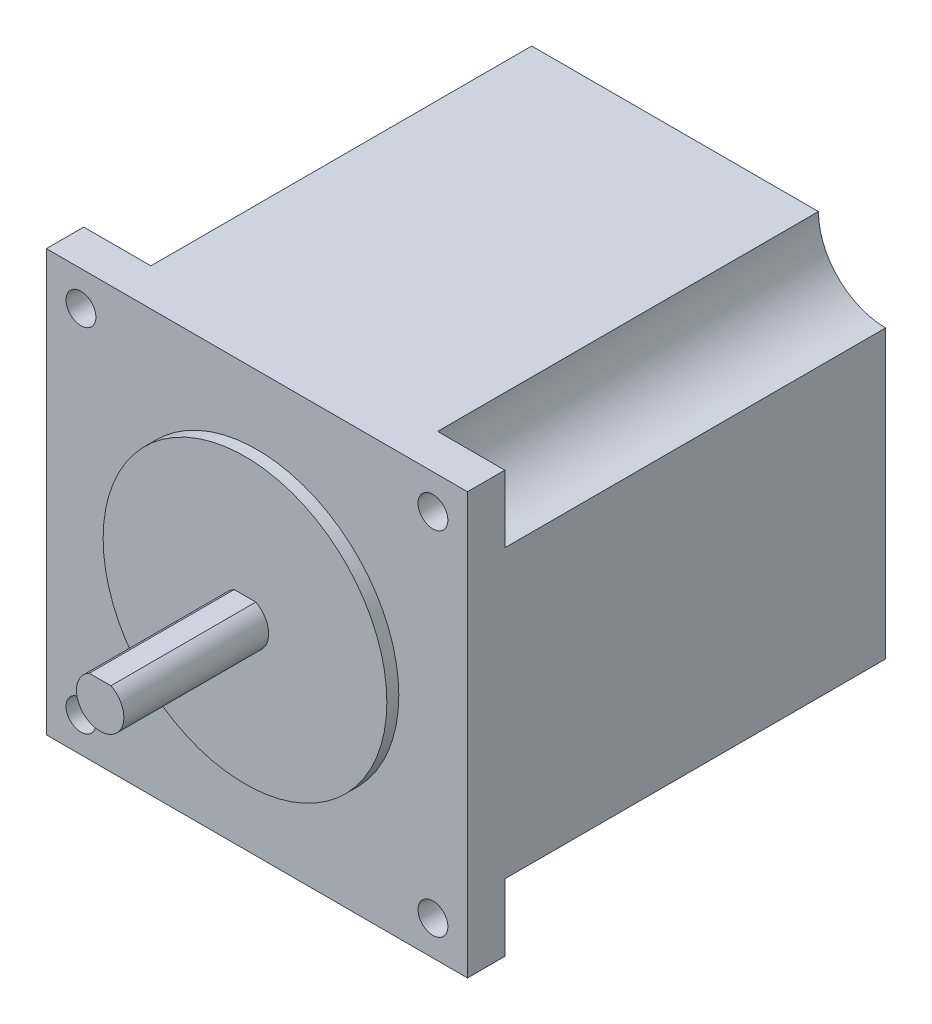
ISO-10303-21;
HEADER;
FILE_DESCRIPTION(('STEP AP214'),'2;1');
FILE_NAME('part.step','',(''),(''),'','','');
FILE_SCHEMA(('AUTOMOTIVE_DESIGN { 1 0 10303 214 1 1 1 1 }'));
ENDSEC;
DATA;
#1=APPLICATION_CONTEXT('core data for automotive mechanical design processes');
#2=APPLICATION_PROTOCOL_DEFINITION('international standard','automotive_design',2000,#1);
#3=PRODUCT_CONTEXT('',#1,'mechanical');
#4=PRODUCT('Part','Part','',(#3));
#5=PRODUCT_RELATED_PRODUCT_CATEGORY('part','',(#4));
#6=PRODUCT_DEFINITION_FORMATION('','',#4);
#7=PRODUCT_DEFINITION_CONTEXT('part definition',#1,'design');
#8=PRODUCT_DEFINITION('design','',#6,#7);
#9=PRODUCT_DEFINITION_SHAPE('','',#8);
#10=(LENGTH_UNIT() NAMED_UNIT(*) SI_UNIT(.MILLI.,.METRE.));
#11=(NAMED_UNIT(*) PLANE_ANGLE_UNIT() SI_UNIT($,.RADIAN.));
#12=(NAMED_UNIT(*) SI_UNIT($,.STERADIAN.) SOLID_ANGLE_UNIT());
#13=UNCERTAINTY_MEASURE_WITH_UNIT(LENGTH_MEASURE(1.E-05),#10,'distance_accuracy_value','');
#14=(GEOMETRIC_REPRESENTATION_CONTEXT(3) GLOBAL_UNCERTAINTY_ASSIGNED_CONTEXT((#13)) GLOBAL_UNIT_ASSIGNED_CONTEXT((#10,
#11,#12)) REPRESENTATION_CONTEXT('',''));
#15=CARTESIAN_POINT('',(0.,0.,0.));
#16=DIRECTION('',(0.,0.,1.));
#17=DIRECTION('',(1.,0.,0.));
#18=AXIS2_PLACEMENT_3D('',#15,#16,#17);
#19=CARTESIAN_POINT('',(23.57,23.57,0.));
#20=DIRECTION('',(0.,0.,1.));
#21=DIRECTION('',(1.,0.,0.));
#22=AXIS2_PLACEMENT_3D('',#19,#20,#21);
#23=CYLINDRICAL_SURFACE('',#22,2.);
#24=CARTESIAN_POINT('',(23.57,23.57,56.));
#25=DIRECTION('',(0.,0.,1.));
#26=DIRECTION('',(1.,0.,0.));
#27=AXIS2_PLACEMENT_3D('',#24,#25,#26);
#28=CIRCLE('',#27,2.);
#29=CARTESIAN_POINT('',(25.57,23.57,56.));
#30=VERTEX_POINT('',#29);
#31=EDGE_CURVE('E270',#30,#30,#28,.T.);
#32=ORIENTED_EDGE('',*,*,#31,.T.);
#33=EDGE_LOOP('',(#32));
#34=FACE_BOUND('',#33,.T.);
#35=CARTESIAN_POINT('',(23.57,23.57,51.));
#36=DIRECTION('',(0.,0.,-1.));
#37=DIRECTION('',(-1.,0.,0.));
#38=AXIS2_PLACEMENT_3D('',#35,#36,#37);
#39=CIRCLE('',#38,2.);
#40=CARTESIAN_POINT('',(21.57,23.57,51.));
#41=VERTEX_POINT('',#40);
#42=EDGE_CURVE('E47',#41,#41,#39,.F.);
#43=ORIENTED_EDGE('',*,*,#42,.F.);
#44=EDGE_LOOP('',(#43));
#45=FACE_BOUND('',#44,.T.);
#46=ADVANCED_FACE('F43',(#34,#45),#23,.F.);
#47=CARTESIAN_POINT('',(-23.57,-23.57,0.));
#48=DIRECTION('',(0.,0.,1.));
#49=DIRECTION('',(1.,0.,0.));
#50=AXIS2_PLACEMENT_3D('',#47,#48,#49);
#51=CYLINDRICAL_SURFACE('',#50,2.00000000000001);
#52=CARTESIAN_POINT('',(-23.57,-23.57,56.));
#53=DIRECTION('',(0.,0.,1.));
#54=DIRECTION('',(1.,0.,0.));
#55=AXIS2_PLACEMENT_3D('',#52,#53,#54);
#56=CIRCLE('',#55,2.00000000000001);
#57=CARTESIAN_POINT('',(-21.57,-23.57,56.));
#58=VERTEX_POINT('',#57);
#59=EDGE_CURVE('E261',#58,#58,#56,.T.);
#60=ORIENTED_EDGE('',*,*,#59,.T.);
#61=EDGE_LOOP('',(#60));
#62=FACE_BOUND('',#61,.T.);
#63=CARTESIAN_POINT('',(-23.57,-23.57,51.));
#64=DIRECTION('',(0.,0.,-1.));
#65=DIRECTION('',(-1.,0.,0.));
#66=AXIS2_PLACEMENT_3D('',#63,#64,#65);
#67=CIRCLE('',#66,2.00000000000001);
#68=CARTESIAN_POINT('',(-25.57,-23.57,51.));
#69=VERTEX_POINT('',#68);
#70=EDGE_CURVE('E210',#69,#69,#67,.F.);
#71=ORIENTED_EDGE('',*,*,#70,.F.);
#72=EDGE_LOOP('',(#71));
#73=FACE_BOUND('',#72,.T.);
#74=ADVANCED_FACE('F365',(#62,#73),#51,.F.);
#75=CARTESIAN_POINT('',(28.2,-28.2,56.));
#76=DIRECTION('',(-1.,0.,0.));
#77=DIRECTION('',(0.,0.,1.));
#78=AXIS2_PLACEMENT_3D('',#75,#76,#77);
#79=PLANE('',#78);
#80=DIRECTION('',(0.,1.,0.));
#81=VECTOR('',#80,1.);
#82=CARTESIAN_POINT('',(28.2,-28.2,51.));
#83=LINE('',#82,#81);
#84=CARTESIAN_POINT('',(28.2,-28.2,51.));
#85=VERTEX_POINT('',#84);
#86=CARTESIAN_POINT('',(28.2,-19.2,51.));
#87=VERTEX_POINT('',#86);
#88=EDGE_CURVE('E214',#85,#87,#83,.T.);
#89=ORIENTED_EDGE('',*,*,#88,.T.);
#90=DIRECTION('',(0.,0.,-1.));
#91=VECTOR('',#90,1.);
#92=CARTESIAN_POINT('',(28.2,-19.2,51.));
#93=LINE('',#92,#91);
#94=CARTESIAN_POINT('',(28.2,-19.2,0.));
#95=VERTEX_POINT('',#94);
#96=EDGE_CURVE('E250',#87,#95,#93,.T.);
#97=ORIENTED_EDGE('',*,*,#96,.T.);
#98=DIRECTION('',(0.,1.,0.));
#99=VECTOR('',#98,1.);
#100=CARTESIAN_POINT('',(28.2,-28.2,0.));
#101=LINE('',#100,#99);
#102=CARTESIAN_POINT('',(28.2,19.2,0.));
#103=VERTEX_POINT('',#102);
#104=EDGE_CURVE('E180',#95,#103,#101,.T.);
#105=ORIENTED_EDGE('',*,*,#104,.T.);
#106=DIRECTION('',(0.,0.,-1.));
#107=VECTOR('',#106,1.);
#108=CARTESIAN_POINT('',(28.2,19.2,51.));
#109=LINE('',#108,#107);
#110=CARTESIAN_POINT('',(28.2,19.2,51.));
#111=VERTEX_POINT('',#110);
#112=EDGE_CURVE('E242',#103,#111,#109,.F.);
#113=ORIENTED_EDGE('',*,*,#112,.T.);
#114=DIRECTION('',(0.,-1.,0.));
#115=VECTOR('',#114,1.);
#116=CARTESIAN_POINT('',(28.2,-28.2,51.));
#117=LINE('',#116,#115);
#118=CARTESIAN_POINT('',(28.2,28.2,51.));
#119=VERTEX_POINT('',#118);
#120=EDGE_CURVE('E235',#119,#111,#117,.T.);
#121=ORIENTED_EDGE('',*,*,#120,.F.);
#122=DIRECTION('',(0.,0.,-1.));
#123=VECTOR('',#122,1.);
#124=CARTESIAN_POINT('',(28.2,28.2,56.));
#125=LINE('',#124,#123);
#126=CARTESIAN_POINT('',(28.2,28.2,56.));
#127=VERTEX_POINT('',#126);
#128=EDGE_CURVE('E196',#127,#119,#125,.T.);
#129=ORIENTED_EDGE('',*,*,#128,.F.);
#130=DIRECTION('',(0.,1.,0.));
#131=VECTOR('',#130,1.);
#132=CARTESIAN_POINT('',(28.2,-28.2,56.));
#133=LINE('',#132,#131);
#134=CARTESIAN_POINT('',(28.2,-28.2,56.));
#135=VERTEX_POINT('',#134);
#136=EDGE_CURVE('E178',#135,#127,#133,.T.);
#137=ORIENTED_EDGE('',*,*,#136,.F.);
#138=DIRECTION('',(0.,0.,-1.));
#139=VECTOR('',#138,1.);
#140=CARTESIAN_POINT('',(28.2,-28.2,56.));
#141=LINE('',#140,#139);
#142=EDGE_CURVE('E184',#135,#85,#141,.T.);
#143=ORIENTED_EDGE('',*,*,#142,.T.);
#144=EDGE_LOOP('',(#89,#97,#105,#113,#121,#129,#137,#143));
#145=FACE_BOUND('',#144,.T.);
#146=ADVANCED_FACE('F45',(#145),#79,.F.);
#147=CARTESIAN_POINT('',(-28.2,28.2,56.));
#148=DIRECTION('',(0.,-1.,0.));
#149=DIRECTION('',(0.,0.,-1.));
#150=AXIS2_PLACEMENT_3D('',#147,#148,#149);
#151=PLANE('',#150);
#152=DIRECTION('',(-1.,0.,0.));
#153=VECTOR('',#152,1.);
#154=CARTESIAN_POINT('',(-28.2,28.2,0.));
#155=LINE('',#154,#153);
#156=CARTESIAN_POINT('',(19.2,28.2,0.));
#157=VERTEX_POINT('',#156);
#158=CARTESIAN_POINT('',(-19.2,28.2,0.));
#159=VERTEX_POINT('',#158);
#160=EDGE_CURVE('E173',#157,#159,#155,.T.);
#161=ORIENTED_EDGE('',*,*,#160,.T.);
#162=DIRECTION('',(0.,0.,-1.));
#163=VECTOR('',#162,1.);
#164=CARTESIAN_POINT('',(-19.2,28.2,51.));
#165=LINE('',#164,#163);
#166=CARTESIAN_POINT('',(-19.2,28.2,51.));
#167=VERTEX_POINT('',#166);
#168=EDGE_CURVE('E61',#159,#167,#165,.F.);
#169=ORIENTED_EDGE('',*,*,#168,.T.);
#170=DIRECTION('',(-1.,0.,0.));
#171=VECTOR('',#170,1.);
#172=CARTESIAN_POINT('',(-28.2,28.2,51.));
#173=LINE('',#172,#171);
#174=CARTESIAN_POINT('',(-28.2,28.2,51.));
#175=VERTEX_POINT('',#174);
#176=EDGE_CURVE('E209',#167,#175,#173,.T.);
#177=ORIENTED_EDGE('',*,*,#176,.T.);
#178=DIRECTION('',(0.,0.,-1.));
#179=VECTOR('',#178,1.);
#180=CARTESIAN_POINT('',(-28.2,28.2,56.));
#181=LINE('',#180,#179);
#182=CARTESIAN_POINT('',(-28.2,28.2,56.));
#183=VERTEX_POINT('',#182);
#184=EDGE_CURVE('E193',#183,#175,#181,.T.);
#185=ORIENTED_EDGE('',*,*,#184,.F.);
#186=DIRECTION('',(-1.,0.,0.));
#187=VECTOR('',#186,1.);
#188=CARTESIAN_POINT('',(-28.2,28.2,56.));
#189=LINE('',#188,#187);
#190=EDGE_CURVE('E305',#127,#183,#189,.T.);
#191=ORIENTED_EDGE('',*,*,#190,.F.);
#192=ORIENTED_EDGE('',*,*,#128,.T.);
#193=DIRECTION('',(1.,0.,0.));
#194=VECTOR('',#193,1.);
#195=CARTESIAN_POINT('',(-28.2,28.2,51.));
#196=LINE('',#195,#194);
#197=CARTESIAN_POINT('',(19.2,28.2,51.));
#198=VERTEX_POINT('',#197);
#199=EDGE_CURVE('E232',#198,#119,#196,.T.);
#200=ORIENTED_EDGE('',*,*,#199,.F.);
#201=DIRECTION('',(0.,0.,-1.));
#202=VECTOR('',#201,1.);
#203=CARTESIAN_POINT('',(19.2,28.2,51.));
#204=LINE('',#203,#202);
#205=EDGE_CURVE('E238',#198,#157,#204,.T.);
#206=ORIENTED_EDGE('',*,*,#205,.T.);
#207=EDGE_LOOP('',(#161,#169,#177,#185,#191,#192,#200,#206));
#208=FACE_BOUND('',#207,.T.);
#209=ADVANCED_FACE('F336',(#208),#151,.F.);
#210=CARTESIAN_POINT('',(-28.2,-28.2,56.));
#211=DIRECTION('',(1.,0.,0.));
#212=DIRECTION('',(0.,0.,-1.));
#213=AXIS2_PLACEMENT_3D('',#210,#211,#212);
#214=PLANE('',#213);
#215=DIRECTION('',(0.,-1.,0.));
#216=VECTOR('',#215,1.);
#217=CARTESIAN_POINT('',(-28.2,-28.2,51.));
#218=LINE('',#217,#216);
#219=CARTESIAN_POINT('',(-28.2,19.2,51.));
#220=VERTEX_POINT('',#219);
#221=EDGE_CURVE('E165',#175,#220,#218,.T.);
#222=ORIENTED_EDGE('',*,*,#221,.T.);
#223=DIRECTION('',(0.,0.,-1.));
#224=VECTOR('',#223,1.);
#225=CARTESIAN_POINT('',(-28.2,19.2,51.));
#226=LINE('',#225,#224);
#227=CARTESIAN_POINT('',(-28.2,19.2,0.));
#228=VERTEX_POINT('',#227);
#229=EDGE_CURVE('E149',#220,#228,#226,.T.);
#230=ORIENTED_EDGE('',*,*,#229,.T.);
#231=DIRECTION('',(0.,-1.,0.));
#232=VECTOR('',#231,1.);
#233=CARTESIAN_POINT('',(-28.2,-28.2,0.));
#234=LINE('',#233,#232);
#235=CARTESIAN_POINT('',(-28.2,-19.2,0.));
#236=VERTEX_POINT('',#235);
#237=EDGE_CURVE('E163',#228,#236,#234,.T.);
#238=ORIENTED_EDGE('',*,*,#237,.T.);
#239=DIRECTION('',(0.,0.,-1.));
#240=VECTOR('',#239,1.);
#241=CARTESIAN_POINT('',(-28.2,-19.2,51.));
#242=LINE('',#241,#240);
#243=CARTESIAN_POINT('',(-28.2,-19.2,51.));
#244=VERTEX_POINT('',#243);
#245=EDGE_CURVE('E69',#236,#244,#242,.F.);
#246=ORIENTED_EDGE('',*,*,#245,.T.);
#247=DIRECTION('',(0.,1.,0.));
#248=VECTOR('',#247,1.);
#249=CARTESIAN_POINT('',(-28.2,-28.2,51.));
#250=LINE('',#249,#248);
#251=CARTESIAN_POINT('',(-28.2,-28.2,51.));
#252=VERTEX_POINT('',#251);
#253=EDGE_CURVE('E219',#252,#244,#250,.T.);
#254=ORIENTED_EDGE('',*,*,#253,.F.);
#255=DIRECTION('',(0.,0.,-1.));
#256=VECTOR('',#255,1.);
#257=CARTESIAN_POINT('',(-28.2,-28.2,56.));
#258=LINE('',#257,#256);
#259=CARTESIAN_POINT('',(-28.2,-28.2,56.));
#260=VERTEX_POINT('',#259);
#261=EDGE_CURVE('E188',#260,#252,#258,.T.);
#262=ORIENTED_EDGE('',*,*,#261,.F.);
#263=DIRECTION('',(0.,-1.,0.));
#264=VECTOR('',#263,1.);
#265=CARTESIAN_POINT('',(-28.2,-28.2,56.));
#266=LINE('',#265,#264);
#267=EDGE_CURVE('E308',#183,#260,#266,.T.);
#268=ORIENTED_EDGE('',*,*,#267,.F.);
#269=ORIENTED_EDGE('',*,*,#184,.T.);
#270=EDGE_LOOP('',(#222,#230,#238,#246,#254,#262,#268,#269));
#271=FACE_BOUND('',#270,.T.);
#272=ADVANCED_FACE('F162',(#271),#214,.F.);
#273=CARTESIAN_POINT('',(-28.2,-28.2,56.));
#274=DIRECTION('',(0.,1.,0.));
#275=DIRECTION('',(0.,0.,1.));
#276=AXIS2_PLACEMENT_3D('',#273,#274,#275);
#277=PLANE('',#276);
#278=DIRECTION('',(-1.,0.,0.));
#279=VECTOR('',#278,1.);
#280=CARTESIAN_POINT('',(-28.2,-28.2,51.));
#281=LINE('',#280,#279);
#282=CARTESIAN_POINT('',(-19.2,-28.2,51.));
#283=VERTEX_POINT('',#282);
#284=EDGE_CURVE('E213',#283,#252,#281,.T.);
#285=ORIENTED_EDGE('',*,*,#284,.F.);
#286=DIRECTION('',(0.,0.,-1.));
#287=VECTOR('',#286,1.);
#288=CARTESIAN_POINT('',(-19.2,-28.2,51.));
#289=LINE('',#288,#287);
#290=CARTESIAN_POINT('',(-19.2,-28.2,0.));
#291=VERTEX_POINT('',#290);
#292=EDGE_CURVE('E253',#283,#291,#289,.T.);
#293=ORIENTED_EDGE('',*,*,#292,.T.);
#294=DIRECTION('',(1.,0.,0.));
#295=VECTOR('',#294,1.);
#296=CARTESIAN_POINT('',(-28.2,-28.2,0.));
#297=LINE('',#296,#295);
#298=CARTESIAN_POINT('',(19.2,-28.2,0.));
#299=VERTEX_POINT('',#298);
#300=EDGE_CURVE('E172',#291,#299,#297,.T.);
#301=ORIENTED_EDGE('',*,*,#300,.T.);
#302=DIRECTION('',(0.,0.,-1.));
#303=VECTOR('',#302,1.);
#304=CARTESIAN_POINT('',(19.2,-28.2,51.));
#305=LINE('',#304,#303);
#306=CARTESIAN_POINT('',(19.2,-28.2,51.));
#307=VERTEX_POINT('',#306);
#308=EDGE_CURVE('E246',#299,#307,#305,.F.);
#309=ORIENTED_EDGE('',*,*,#308,.T.);
#310=DIRECTION('',(1.,0.,0.));
#311=VECTOR('',#310,1.);
#312=CARTESIAN_POINT('',(-28.2,-28.2,51.));
#313=LINE('',#312,#311);
#314=EDGE_CURVE('E208',#307,#85,#313,.T.);
#315=ORIENTED_EDGE('',*,*,#314,.T.);
#316=ORIENTED_EDGE('',*,*,#142,.F.);
#317=DIRECTION('',(1.,0.,0.));
#318=VECTOR('',#317,1.);
#319=CARTESIAN_POINT('',(-28.2,-28.2,56.));
#320=LINE('',#319,#318);
#321=EDGE_CURVE('E189',#260,#135,#320,.T.);
#322=ORIENTED_EDGE('',*,*,#321,.F.);
#323=ORIENTED_EDGE('',*,*,#261,.T.);
#324=EDGE_LOOP('',(#285,#293,#301,#309,#315,#316,#322,#323));
#325=FACE_BOUND('',#324,.T.);
#326=ADVANCED_FACE('F399',(#325),#277,.F.);
#327=CARTESIAN_POINT('',(0.,0.,56.));
#328=DIRECTION('',(0.,0.,-1.));
#329=DIRECTION('',(-1.,0.,0.));
#330=AXIS2_PLACEMENT_3D('',#327,#328,#329);
#331=PLANE('',#330);
#332=CARTESIAN_POINT('',(-23.57,23.57,56.));
#333=DIRECTION('',(0.,0.,1.));
#334=DIRECTION('',(-1.,0.,0.));
#335=AXIS2_PLACEMENT_3D('',#332,#333,#334);
#336=CIRCLE('',#335,2.);
#337=CARTESIAN_POINT('',(-25.57,23.57,56.));
#338=VERTEX_POINT('',#337);
#339=EDGE_CURVE('E266',#338,#338,#336,.T.);
#340=ORIENTED_EDGE('',*,*,#339,.F.);
#341=EDGE_LOOP('',(#340));
#342=FACE_BOUND('',#341,.T.);
#343=CARTESIAN_POINT('',(23.57,-23.57,56.));
#344=DIRECTION('',(0.,0.,1.));
#345=DIRECTION('',(-1.,0.,0.));
#346=AXIS2_PLACEMENT_3D('',#343,#344,#345);
#347=CIRCLE('',#346,2.);
#348=CARTESIAN_POINT('',(21.57,-23.57,56.));
#349=VERTEX_POINT('',#348);
#350=EDGE_CURVE('E265',#349,#349,#347,.T.);
#351=ORIENTED_EDGE('',*,*,#350,.F.);
#352=EDGE_LOOP('',(#351));
#353=FACE_BOUND('',#352,.T.);
#354=ORIENTED_EDGE('',*,*,#59,.F.);
#355=EDGE_LOOP('',(#354));
#356=FACE_BOUND('',#355,.T.);
#357=ORIENTED_EDGE('',*,*,#31,.F.);
#358=EDGE_LOOP('',(#357));
#359=FACE_BOUND('',#358,.T.);
#360=CARTESIAN_POINT('',(0.,0.,56.));
#361=DIRECTION('',(0.,0.,1.));
#362=DIRECTION('',(1.,0.,0.));
#363=AXIS2_PLACEMENT_3D('',#360,#361,#362);
#364=CIRCLE('',#363,19.);
#365=CARTESIAN_POINT('',(19.,0.,56.));
#366=VERTEX_POINT('',#365);
#367=EDGE_CURVE('E53',#366,#366,#364,.T.);
#368=ORIENTED_EDGE('',*,*,#367,.F.);
#369=EDGE_LOOP('',(#368));
#370=FACE_BOUND('',#369,.T.);
#371=ORIENTED_EDGE('',*,*,#136,.T.);
#372=ORIENTED_EDGE('',*,*,#190,.T.);
#373=ORIENTED_EDGE('',*,*,#267,.T.);
#374=ORIENTED_EDGE('',*,*,#321,.T.);
#375=EDGE_LOOP('',(#371,#372,#373,#374));
#376=FACE_BOUND('',#375,.T.);
#377=ADVANCED_FACE('F343',(#342,#353,#356,#359,#370,#376),#331,.F.);
#378=CARTESIAN_POINT('',(0.,0.,0.));
#379=DIRECTION('',(0.,0.,-1.));
#380=DIRECTION('',(-1.,0.,0.));
#381=AXIS2_PLACEMENT_3D('',#378,#379,#380);
#382=PLANE('',#381);
#383=CARTESIAN_POINT('',(-28.2,28.2,0.));
#384=DIRECTION('',(0.,0.,-1.));
#385=DIRECTION('',(1.,0.,0.));
#386=AXIS2_PLACEMENT_3D('',#383,#384,#385);
#387=CIRCLE('',#386,9.);
#388=EDGE_CURVE('E146',#159,#228,#387,.T.);
#389=ORIENTED_EDGE('',*,*,#388,.F.);
#390=ORIENTED_EDGE('',*,*,#160,.F.);
#391=CARTESIAN_POINT('',(28.2,28.2,0.));
#392=DIRECTION('',(0.,0.,-1.));
#393=DIRECTION('',(-1.,0.,0.));
#394=AXIS2_PLACEMENT_3D('',#391,#392,#393);
#395=CIRCLE('',#394,9.);
#396=EDGE_CURVE('E319',#103,#157,#395,.T.);
#397=ORIENTED_EDGE('',*,*,#396,.F.);
#398=ORIENTED_EDGE('',*,*,#104,.F.);
#399=CARTESIAN_POINT('',(28.2,-28.2,0.));
#400=DIRECTION('',(0.,0.,-1.));
#401=DIRECTION('',(1.,0.,0.));
#402=AXIS2_PLACEMENT_3D('',#399,#400,#401);
#403=CIRCLE('',#402,9.);
#404=EDGE_CURVE('E318',#299,#95,#403,.T.);
#405=ORIENTED_EDGE('',*,*,#404,.F.);
#406=ORIENTED_EDGE('',*,*,#300,.F.);
#407=CARTESIAN_POINT('',(-28.2,-28.2,0.));
#408=DIRECTION('',(0.,0.,-1.));
#409=DIRECTION('',(-1.,0.,0.));
#410=AXIS2_PLACEMENT_3D('',#407,#408,#409);
#411=CIRCLE('',#410,9.);
#412=EDGE_CURVE('E170',#236,#291,#411,.T.);
#413=ORIENTED_EDGE('',*,*,#412,.F.);
#414=ORIENTED_EDGE('',*,*,#237,.F.);
#415=EDGE_LOOP('',(#389,#390,#397,#398,#405,#406,#413,#414));
#416=FACE_BOUND('',#415,.T.);
#417=ADVANCED_FACE('F168',(#416),#382,.T.);
#418=CARTESIAN_POINT('',(0.,0.,57.6));
#419=DIRECTION('',(0.,0.,-1.));
#420=DIRECTION('',(-1.,0.,0.));
#421=AXIS2_PLACEMENT_3D('',#418,#419,#420);
#422=CYLINDRICAL_SURFACE('',#421,19.);
#423=CARTESIAN_POINT('',(0.,0.,57.6));
#424=DIRECTION('',(0.,0.,1.));
#425=DIRECTION('',(1.,0.,0.));
#426=AXIS2_PLACEMENT_3D('',#423,#424,#425);
#427=CIRCLE('',#426,19.);
#428=CARTESIAN_POINT('',(19.,0.,57.6));
#429=VERTEX_POINT('',#428);
#430=EDGE_CURVE('E294',#429,#429,#427,.T.);
#431=ORIENTED_EDGE('',*,*,#430,.F.);
#432=EDGE_LOOP('',(#431));
#433=FACE_BOUND('',#432,.T.);
#434=ORIENTED_EDGE('',*,*,#367,.T.);
#435=EDGE_LOOP('',(#434));
#436=FACE_BOUND('',#435,.T.);
#437=ADVANCED_FACE('F392',(#433,#436),#422,.T.);
#438=CARTESIAN_POINT('',(0.,0.,57.6));
#439=DIRECTION('',(0.,0.,1.));
#440=DIRECTION('',(1.,0.,0.));
#441=AXIS2_PLACEMENT_3D('',#438,#439,#440);
#442=PLANE('',#441);
#443=CARTESIAN_POINT('',(0.,0.,57.6));
#444=DIRECTION('',(0.,0.,1.));
#445=DIRECTION('',(1.,0.,0.));
#446=AXIS2_PLACEMENT_3D('',#443,#444,#445);
#447=CIRCLE('',#446,3.175);
#448=CARTESIAN_POINT('',(-1.44913767461895,2.825,57.6));
#449=VERTEX_POINT('',#448);
#450=CARTESIAN_POINT('',(1.44913767461895,2.825,57.6));
#451=VERTEX_POINT('',#450);
#452=EDGE_CURVE('E11',#449,#451,#447,.T.);
#453=ORIENTED_EDGE('',*,*,#452,.F.);
#454=DIRECTION('',(1.,0.,0.));
#455=VECTOR('',#454,1.);
#456=CARTESIAN_POINT('',(0.,2.825,57.6));
#457=LINE('',#456,#455);
#458=EDGE_CURVE('E278',#449,#451,#457,.T.);
#459=ORIENTED_EDGE('',*,*,#458,.T.);
#460=EDGE_LOOP('',(#453,#459));
#461=FACE_BOUND('',#460,.T.);
#462=ORIENTED_EDGE('',*,*,#430,.T.);
#463=EDGE_LOOP('',(#462));
#464=FACE_BOUND('',#463,.T.);
#465=ADVANCED_FACE('F388',(#461,#464),#442,.T.);
#466=CARTESIAN_POINT('',(0.,0.,77.));
#467=DIRECTION('',(0.,0.,-1.));
#468=DIRECTION('',(-1.,0.,0.));
#469=AXIS2_PLACEMENT_3D('',#466,#467,#468);
#470=CYLINDRICAL_SURFACE('',#469,3.175);
#471=CARTESIAN_POINT('',(0.,0.,77.));
#472=DIRECTION('',(0.,0.,1.));
#473=DIRECTION('',(1.,0.,0.));
#474=AXIS2_PLACEMENT_3D('',#471,#472,#473);
#475=CIRCLE('',#474,3.175);
#476=CARTESIAN_POINT('',(-1.44913767461895,2.825,77.));
#477=VERTEX_POINT('',#476);
#478=CARTESIAN_POINT('',(1.44913767461895,2.825,77.));
#479=VERTEX_POINT('',#478);
#480=EDGE_CURVE('E289',#477,#479,#475,.T.);
#481=ORIENTED_EDGE('',*,*,#480,.F.);
#482=DIRECTION('',(0.,0.,1.));
#483=VECTOR('',#482,1.);
#484=CARTESIAN_POINT('',(-1.44913767461895,2.825,57.6));
#485=LINE('',#484,#483);
#486=EDGE_CURVE('E282',#449,#477,#485,.T.);
#487=ORIENTED_EDGE('',*,*,#486,.F.);
#488=ORIENTED_EDGE('',*,*,#452,.T.);
#489=DIRECTION('',(0.,0.,1.));
#490=VECTOR('',#489,1.);
#491=CARTESIAN_POINT('',(1.44913767461895,2.825,57.6));
#492=LINE('',#491,#490);
#493=EDGE_CURVE('E285',#451,#479,#492,.T.);
#494=ORIENTED_EDGE('',*,*,#493,.T.);
#495=EDGE_LOOP('',(#481,#487,#488,#494));
#496=FACE_BOUND('',#495,.T.);
#497=ADVANCED_FACE('F384',(#496),#470,.T.);
#498=CARTESIAN_POINT('',(0.,0.,77.));
#499=DIRECTION('',(0.,0.,1.));
#500=DIRECTION('',(1.,0.,0.));
#501=AXIS2_PLACEMENT_3D('',#498,#499,#500);
#502=PLANE('',#501);
#503=DIRECTION('',(1.,0.,0.));
#504=VECTOR('',#503,1.);
#505=CARTESIAN_POINT('',(0.,2.825,77.));
#506=LINE('',#505,#504);
#507=EDGE_CURVE('E277',#477,#479,#506,.T.);
#508=ORIENTED_EDGE('',*,*,#507,.F.);
#509=ORIENTED_EDGE('',*,*,#480,.T.);
#510=EDGE_LOOP('',(#508,#509));
#511=FACE_BOUND('',#510,.T.);
#512=ADVANCED_FACE('F380',(#511),#502,.T.);
#513=CARTESIAN_POINT('',(0.,2.825,57.6));
#514=DIRECTION('',(0.,-1.,0.));
#515=DIRECTION('',(0.,0.,-1.));
#516=AXIS2_PLACEMENT_3D('',#513,#514,#515);
#517=PLANE('',#516);
#518=ORIENTED_EDGE('',*,*,#507,.T.);
#519=ORIENTED_EDGE('',*,*,#493,.F.);
#520=ORIENTED_EDGE('',*,*,#458,.F.);
#521=ORIENTED_EDGE('',*,*,#486,.T.);
#522=EDGE_LOOP('',(#518,#519,#520,#521));
#523=FACE_BOUND('',#522,.T.);
#524=ADVANCED_FACE('F377',(#523),#517,.F.);
#525=CARTESIAN_POINT('',(23.57,-23.57,0.));
#526=DIRECTION('',(0.,0.,1.));
#527=DIRECTION('',(1.,0.,0.));
#528=AXIS2_PLACEMENT_3D('',#525,#526,#527);
#529=CYLINDRICAL_SURFACE('',#528,2.);
#530=CARTESIAN_POINT('',(23.57,-23.57,51.));
#531=DIRECTION('',(0.,0.,1.));
#532=DIRECTION('',(1.,0.,0.));
#533=AXIS2_PLACEMENT_3D('',#530,#531,#532);
#534=CIRCLE('',#533,2.);
#535=CARTESIAN_POINT('',(25.57,-23.57,51.));
#536=VERTEX_POINT('',#535);
#537=EDGE_CURVE('E205',#536,#536,#534,.F.);
#538=ORIENTED_EDGE('',*,*,#537,.T.);
#539=EDGE_LOOP('',(#538));
#540=FACE_BOUND('',#539,.T.);
#541=ORIENTED_EDGE('',*,*,#350,.T.);
#542=EDGE_LOOP('',(#541));
#543=FACE_BOUND('',#542,.T.);
#544=ADVANCED_FACE('F375',(#540,#543),#529,.F.);
#545=CARTESIAN_POINT('',(-23.57,23.57,0.));
#546=DIRECTION('',(0.,0.,1.));
#547=DIRECTION('',(1.,0.,0.));
#548=AXIS2_PLACEMENT_3D('',#545,#546,#547);
#549=CYLINDRICAL_SURFACE('',#548,2.);
#550=CARTESIAN_POINT('',(-23.57,23.57,51.));
#551=DIRECTION('',(0.,0.,1.));
#552=DIRECTION('',(1.,0.,0.));
#553=AXIS2_PLACEMENT_3D('',#550,#551,#552);
#554=CIRCLE('',#553,2.);
#555=CARTESIAN_POINT('',(-21.57,23.57,51.));
#556=VERTEX_POINT('',#555);
#557=EDGE_CURVE('E200',#556,#556,#554,.F.);
#558=ORIENTED_EDGE('',*,*,#557,.T.);
#559=EDGE_LOOP('',(#558));
#560=FACE_BOUND('',#559,.T.);
#561=ORIENTED_EDGE('',*,*,#339,.T.);
#562=EDGE_LOOP('',(#561));
#563=FACE_BOUND('',#562,.T.);
#564=ADVANCED_FACE('F485',(#560,#563),#549,.F.);
#565=CARTESIAN_POINT('',(-28.2,28.2,51.));
#566=DIRECTION('',(0.,0.,-1.));
#567=DIRECTION('',(-1.,0.,0.));
#568=AXIS2_PLACEMENT_3D('',#565,#566,#567);
#569=CYLINDRICAL_SURFACE('',#568,9.);
#570=ORIENTED_EDGE('',*,*,#388,.T.);
#571=ORIENTED_EDGE('',*,*,#229,.F.);
#572=CARTESIAN_POINT('',(-28.2,28.2,51.));
#573=DIRECTION('',(0.,0.,-1.));
#574=DIRECTION('',(1.,0.,0.));
#575=AXIS2_PLACEMENT_3D('',#572,#573,#574);
#576=CIRCLE('',#575,9.);
#577=EDGE_CURVE('E157',#167,#220,#576,.T.);
#578=ORIENTED_EDGE('',*,*,#577,.F.);
#579=ORIENTED_EDGE('',*,*,#168,.F.);
#580=EDGE_LOOP('',(#570,#571,#578,#579));
#581=FACE_BOUND('',#580,.T.);
#582=ADVANCED_FACE('F148',(#581),#569,.F.);
#583=CARTESIAN_POINT('',(-28.2,28.2,51.));
#584=DIRECTION('',(0.,0.,1.));
#585=DIRECTION('',(1.,0.,0.));
#586=AXIS2_PLACEMENT_3D('',#583,#584,#585);
#587=PLANE('',#586);
#588=ORIENTED_EDGE('',*,*,#557,.F.);
#589=EDGE_LOOP('',(#588));
#590=FACE_BOUND('',#589,.T.);
#591=ORIENTED_EDGE('',*,*,#577,.T.);
#592=ORIENTED_EDGE('',*,*,#221,.F.);
#593=ORIENTED_EDGE('',*,*,#176,.F.);
#594=EDGE_LOOP('',(#591,#592,#593));
#595=FACE_BOUND('',#594,.T.);
#596=ADVANCED_FACE('F503',(#590,#595),#587,.F.);
#597=CARTESIAN_POINT('',(28.2,-28.2,51.));
#598=DIRECTION('',(0.,0.,-1.));
#599=DIRECTION('',(-1.,0.,0.));
#600=AXIS2_PLACEMENT_3D('',#597,#598,#599);
#601=CYLINDRICAL_SURFACE('',#600,9.);
#602=CARTESIAN_POINT('',(28.2,-28.2,51.));
#603=DIRECTION('',(0.,0.,-1.));
#604=DIRECTION('',(1.,0.,0.));
#605=AXIS2_PLACEMENT_3D('',#602,#603,#604);
#606=CIRCLE('',#605,9.);
#607=EDGE_CURVE('E327',#307,#87,#606,.T.);
#608=ORIENTED_EDGE('',*,*,#607,.F.);
#609=ORIENTED_EDGE('',*,*,#308,.F.);
#610=ORIENTED_EDGE('',*,*,#404,.T.);
#611=ORIENTED_EDGE('',*,*,#96,.F.);
#612=EDGE_LOOP('',(#608,#609,#610,#611));
#613=FACE_BOUND('',#612,.T.);
#614=ADVANCED_FACE('F512',(#613),#601,.F.);
#615=CARTESIAN_POINT('',(28.2,-28.2,51.));
#616=DIRECTION('',(0.,0.,1.));
#617=DIRECTION('',(1.,0.,0.));
#618=AXIS2_PLACEMENT_3D('',#615,#616,#617);
#619=PLANE('',#618);
#620=ORIENTED_EDGE('',*,*,#537,.F.);
#621=EDGE_LOOP('',(#620));
#622=FACE_BOUND('',#621,.T.);
#623=ORIENTED_EDGE('',*,*,#314,.F.);
#624=ORIENTED_EDGE('',*,*,#607,.T.);
#625=ORIENTED_EDGE('',*,*,#88,.F.);
#626=EDGE_LOOP('',(#623,#624,#625));
#627=FACE_BOUND('',#626,.T.);
#628=ADVANCED_FACE('F523',(#622,#627),#619,.F.);
#629=CARTESIAN_POINT('',(-28.2,-28.2,51.));
#630=DIRECTION('',(0.,0.,-1.));
#631=DIRECTION('',(-1.,0.,0.));
#632=AXIS2_PLACEMENT_3D('',#629,#630,#631);
#633=CYLINDRICAL_SURFACE('',#632,9.);
#634=ORIENTED_EDGE('',*,*,#412,.T.);
#635=ORIENTED_EDGE('',*,*,#292,.F.);
#636=CARTESIAN_POINT('',(-28.2,-28.2,51.));
#637=DIRECTION('',(0.,0.,-1.));
#638=DIRECTION('',(-1.,0.,0.));
#639=AXIS2_PLACEMENT_3D('',#636,#637,#638);
#640=CIRCLE('',#639,9.);
#641=EDGE_CURVE('E156',#244,#283,#640,.T.);
#642=ORIENTED_EDGE('',*,*,#641,.F.);
#643=ORIENTED_EDGE('',*,*,#245,.F.);
#644=EDGE_LOOP('',(#634,#635,#642,#643));
#645=FACE_BOUND('',#644,.T.);
#646=ADVANCED_FACE('F361',(#645),#633,.F.);
#647=CARTESIAN_POINT('',(-28.2,-28.2,51.));
#648=DIRECTION('',(0.,0.,-1.));
#649=DIRECTION('',(-1.,0.,0.));
#650=AXIS2_PLACEMENT_3D('',#647,#648,#649);
#651=PLANE('',#650);
#652=ORIENTED_EDGE('',*,*,#70,.T.);
#653=EDGE_LOOP('',(#652));
#654=FACE_BOUND('',#653,.T.);
#655=ORIENTED_EDGE('',*,*,#253,.T.);
#656=ORIENTED_EDGE('',*,*,#641,.T.);
#657=ORIENTED_EDGE('',*,*,#284,.T.);
#658=EDGE_LOOP('',(#655,#656,#657));
#659=FACE_BOUND('',#658,.T.);
#660=ADVANCED_FACE('F353',(#654,#659),#651,.T.);
#661=CARTESIAN_POINT('',(28.2,28.2,51.));
#662=DIRECTION('',(0.,0.,-1.));
#663=DIRECTION('',(-1.,0.,0.));
#664=AXIS2_PLACEMENT_3D('',#661,#662,#663);
#665=CYLINDRICAL_SURFACE('',#664,9.);
#666=ORIENTED_EDGE('',*,*,#396,.T.);
#667=ORIENTED_EDGE('',*,*,#205,.F.);
#668=CARTESIAN_POINT('',(28.2,28.2,51.));
#669=DIRECTION('',(0.,0.,-1.));
#670=DIRECTION('',(-1.,0.,0.));
#671=AXIS2_PLACEMENT_3D('',#668,#669,#670);
#672=CIRCLE('',#671,9.);
#673=EDGE_CURVE('E204',#111,#198,#672,.T.);
#674=ORIENTED_EDGE('',*,*,#673,.F.);
#675=ORIENTED_EDGE('',*,*,#112,.F.);
#676=EDGE_LOOP('',(#666,#667,#674,#675));
#677=FACE_BOUND('',#676,.T.);
#678=ADVANCED_FACE('F351',(#677),#665,.F.);
#679=CARTESIAN_POINT('',(28.2,28.2,51.));
#680=DIRECTION('',(0.,0.,-1.));
#681=DIRECTION('',(-1.,0.,0.));
#682=AXIS2_PLACEMENT_3D('',#679,#680,#681);
#683=PLANE('',#682);
#684=ORIENTED_EDGE('',*,*,#42,.T.);
#685=EDGE_LOOP('',(#684));
#686=FACE_BOUND('',#685,.T.);
#687=ORIENTED_EDGE('',*,*,#120,.T.);
#688=ORIENTED_EDGE('',*,*,#673,.T.);
#689=ORIENTED_EDGE('',*,*,#199,.T.);
#690=EDGE_LOOP('',(#687,#688,#689));
#691=FACE_BOUND('',#690,.T.);
#692=ADVANCED_FACE('F350',(#686,#691),#683,.T.);
#693=CLOSED_SHELL('',(#46,#74,#146,#209,#272,#326,#377,#417,#437,#465,#497,#512,#524,#544,#564,
#582,#596,#614,#628,#646,#660,#678,#692));
#694=MANIFOLD_SOLID_BREP('B2',#693);
#695=ADVANCED_BREP_SHAPE_REPRESENTATION('',(#18,#694),#14);
#696=SHAPE_DEFINITION_REPRESENTATION(#9,#695);
ENDSEC;
END-ISO-10303-21;
